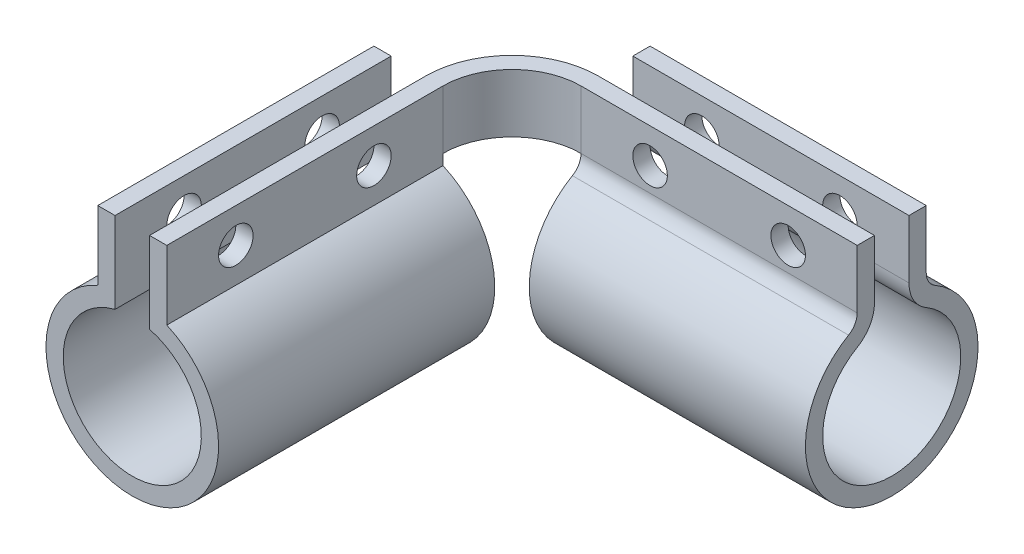
ISO-10303-21;
HEADER;
FILE_DESCRIPTION(('STEP AP214'),'2;1');
FILE_NAME('part.step','',(''),(''),'','','');
FILE_SCHEMA(('AUTOMOTIVE_DESIGN { 1 0 10303 214 1 1 1 1 }'));
ENDSEC;
DATA;
#1=APPLICATION_CONTEXT('core data for automotive mechanical design processes');
#2=APPLICATION_PROTOCOL_DEFINITION('international standard','automotive_design',2000,#1);
#3=PRODUCT_CONTEXT('',#1,'mechanical');
#4=PRODUCT('Part','Part','',(#3));
#5=PRODUCT_RELATED_PRODUCT_CATEGORY('part','',(#4));
#6=PRODUCT_DEFINITION_FORMATION('','',#4);
#7=PRODUCT_DEFINITION_CONTEXT('part definition',#1,'design');
#8=PRODUCT_DEFINITION('design','',#6,#7);
#9=PRODUCT_DEFINITION_SHAPE('','',#8);
#10=(LENGTH_UNIT() NAMED_UNIT(*) SI_UNIT(.MILLI.,.METRE.));
#11=(NAMED_UNIT(*) PLANE_ANGLE_UNIT() SI_UNIT($,.RADIAN.));
#12=(NAMED_UNIT(*) SI_UNIT($,.STERADIAN.) SOLID_ANGLE_UNIT());
#13=UNCERTAINTY_MEASURE_WITH_UNIT(LENGTH_MEASURE(1.E-05),#10,'distance_accuracy_value','');
#14=(GEOMETRIC_REPRESENTATION_CONTEXT(3) GLOBAL_UNCERTAINTY_ASSIGNED_CONTEXT((#13)) GLOBAL_UNIT_ASSIGNED_CONTEXT((#10,
#11,#12)) REPRESENTATION_CONTEXT('',''));
#15=CARTESIAN_POINT('',(0.,0.,0.));
#16=DIRECTION('',(0.,0.,1.));
#17=DIRECTION('',(1.,0.,0.));
#18=AXIS2_PLACEMENT_3D('',#15,#16,#17);
#19=CARTESIAN_POINT('',(80.,0.,10.));
#20=DIRECTION('',(0.,0.,1.));
#21=DIRECTION('',(1.,0.,0.));
#22=AXIS2_PLACEMENT_3D('',#19,#20,#21);
#23=PLANE('',#22);
#24=CARTESIAN_POINT('',(60.,32.9128784747792,10.));
#25=DIRECTION('',(0.,0.,1.));
#26=DIRECTION('',(1.,0.,0.));
#27=AXIS2_PLACEMENT_3D('',#24,#25,#26);
#28=CIRCLE('',#27,4.99999999999999);
#29=CARTESIAN_POINT('',(65.,32.9128784747792,10.));
#30=VERTEX_POINT('',#29);
#31=EDGE_CURVE('E270',#30,#30,#28,.T.);
#32=ORIENTED_EDGE('',*,*,#31,.F.);
#33=EDGE_LOOP('',(#32));
#34=FACE_BOUND('',#33,.T.);
#35=CARTESIAN_POINT('',(20.,32.9128784747792,10.));
#36=DIRECTION('',(0.,0.,1.));
#37=DIRECTION('',(1.,0.,0.));
#38=AXIS2_PLACEMENT_3D('',#35,#36,#37);
#39=CIRCLE('',#38,5.);
#40=CARTESIAN_POINT('',(25.,32.9128784747792,10.));
#41=VERTEX_POINT('',#40);
#42=EDGE_CURVE('E462',#41,#41,#39,.T.);
#43=ORIENTED_EDGE('',*,*,#42,.F.);
#44=EDGE_LOOP('',(#43));
#45=FACE_BOUND('',#44,.T.);
#46=DIRECTION('',(-1.,0.,0.));
#47=VECTOR('',#46,1.);
#48=CARTESIAN_POINT('',(80.,42.9128784747792,10.));
#49=LINE('',#48,#47);
#50=CARTESIAN_POINT('',(80.,42.9128784747792,10.));
#51=VERTEX_POINT('',#50);
#52=CARTESIAN_POINT('',(0.,42.9128784747792,10.));
#53=VERTEX_POINT('',#52);
#54=EDGE_CURVE('E423',#51,#53,#49,.T.);
#55=ORIENTED_EDGE('',*,*,#54,.T.);
#56=DIRECTION('',(0.,-1.,0.));
#57=VECTOR('',#56,1.);
#58=CARTESIAN_POINT('',(0.,0.,10.));
#59=LINE('',#58,#57);
#60=CARTESIAN_POINT('',(0.,25.98076,10.));
#61=VERTEX_POINT('',#60);
#62=EDGE_CURVE('E260',#53,#61,#59,.T.);
#63=ORIENTED_EDGE('',*,*,#62,.T.);
#64=DIRECTION('',(-1.,0.,0.));
#65=VECTOR('',#64,1.);
#66=CARTESIAN_POINT('',(80.,25.9807621135332,10.));
#67=LINE('',#66,#65);
#68=CARTESIAN_POINT('',(80.,25.9807621135332,10.));
#69=VERTEX_POINT('',#68);
#70=EDGE_CURVE('E400',#61,#69,#67,.F.);
#71=ORIENTED_EDGE('',*,*,#70,.T.);
#72=DIRECTION('',(0.,1.,0.));
#73=VECTOR('',#72,1.);
#74=CARTESIAN_POINT('',(80.,0.,10.));
#75=LINE('',#74,#73);
#76=EDGE_CURVE('E429',#69,#51,#75,.T.);
#77=ORIENTED_EDGE('',*,*,#76,.T.);
#78=EDGE_LOOP('',(#55,#63,#71,#77));
#79=FACE_BOUND('',#78,.T.);
#80=ADVANCED_FACE('F37',(#34,#45,#79),#23,.T.);
#81=CARTESIAN_POINT('',(80.,0.,0.));
#82=DIRECTION('',(-1.,0.,0.));
#83=DIRECTION('',(0.,0.,1.));
#84=AXIS2_PLACEMENT_3D('',#81,#82,#83);
#85=CYLINDRICAL_SURFACE('',#84,25.);
#86=CARTESIAN_POINT('',(80.,0.,0.));
#87=DIRECTION('',(1.,0.,0.));
#88=DIRECTION('',(0.,0.,-1.));
#89=AXIS2_PLACEMENT_3D('',#86,#87,#88);
#90=CIRCLE('',#89,25.);
#91=CARTESIAN_POINT('',(80.,21.650635094611,12.5));
#92=VERTEX_POINT('',#91);
#93=CARTESIAN_POINT('',(80.,21.650635094611,-12.5));
#94=VERTEX_POINT('',#93);
#95=EDGE_CURVE('E456',#92,#94,#90,.T.);
#96=ORIENTED_EDGE('',*,*,#95,.F.);
#97=DIRECTION('',(-1.,0.,0.));
#98=VECTOR('',#97,1.);
#99=CARTESIAN_POINT('',(80.,21.650635094611,12.5));
#100=LINE('',#99,#98);
#101=CARTESIAN_POINT('',(0.,21.650635094611,12.5));
#102=VERTEX_POINT('',#101);
#103=EDGE_CURVE('E402',#92,#102,#100,.T.);
#104=ORIENTED_EDGE('',*,*,#103,.T.);
#105=CARTESIAN_POINT('',(0.,0.,0.));
#106=DIRECTION('',(1.,0.,0.));
#107=DIRECTION('',(0.,0.,-1.));
#108=AXIS2_PLACEMENT_3D('',#105,#106,#107);
#109=CIRCLE('',#108,25.);
#110=CARTESIAN_POINT('',(0.,21.650635094611,-12.5));
#111=VERTEX_POINT('',#110);
#112=EDGE_CURVE('E438',#102,#111,#109,.T.);
#113=ORIENTED_EDGE('',*,*,#112,.T.);
#114=DIRECTION('',(-1.,0.,0.));
#115=VECTOR('',#114,1.);
#116=CARTESIAN_POINT('',(80.,21.650635094611,-12.5));
#117=LINE('',#116,#115);
#118=EDGE_CURVE('E405',#111,#94,#117,.F.);
#119=ORIENTED_EDGE('',*,*,#118,.T.);
#120=EDGE_LOOP('',(#96,#104,#113,#119));
#121=FACE_BOUND('',#120,.T.);
#122=ADVANCED_FACE('F314',(#121),#85,.T.);
#123=CARTESIAN_POINT('',(80.,0.,-10.));
#124=DIRECTION('',(0.,0.,-1.));
#125=DIRECTION('',(0.,1.,0.));
#126=AXIS2_PLACEMENT_3D('',#123,#124,#125);
#127=PLANE('',#126);
#128=CARTESIAN_POINT('',(60.,32.9128784747792,-10.));
#129=DIRECTION('',(0.,0.,1.));
#130=DIRECTION('',(1.,0.,0.));
#131=AXIS2_PLACEMENT_3D('',#128,#129,#130);
#132=CIRCLE('',#131,4.99999999999999);
#133=CARTESIAN_POINT('',(65.,32.9128784747792,-10.));
#134=VERTEX_POINT('',#133);
#135=EDGE_CURVE('E248',#134,#134,#132,.T.);
#136=ORIENTED_EDGE('',*,*,#135,.T.);
#137=EDGE_LOOP('',(#136));
#138=FACE_BOUND('',#137,.T.);
#139=CARTESIAN_POINT('',(20.,32.9128784747792,-10.));
#140=DIRECTION('',(0.,0.,1.));
#141=DIRECTION('',(1.,0.,0.));
#142=AXIS2_PLACEMENT_3D('',#139,#140,#141);
#143=CIRCLE('',#142,5.);
#144=CARTESIAN_POINT('',(25.,32.9128784747792,-10.));
#145=VERTEX_POINT('',#144);
#146=EDGE_CURVE('E416',#145,#145,#143,.T.);
#147=ORIENTED_EDGE('',*,*,#146,.T.);
#148=EDGE_LOOP('',(#147));
#149=FACE_BOUND('',#148,.T.);
#150=DIRECTION('',(0.,-1.,0.));
#151=VECTOR('',#150,1.);
#152=CARTESIAN_POINT('',(80.,0.,-10.));
#153=LINE('',#152,#151);
#154=CARTESIAN_POINT('',(80.,42.9128784747792,-10.));
#155=VERTEX_POINT('',#154);
#156=CARTESIAN_POINT('',(80.,25.9807621135332,-10.));
#157=VERTEX_POINT('',#156);
#158=EDGE_CURVE('E453',#155,#157,#153,.T.);
#159=ORIENTED_EDGE('',*,*,#158,.T.);
#160=DIRECTION('',(-1.,0.,0.));
#161=VECTOR('',#160,1.);
#162=CARTESIAN_POINT('',(80.,25.9807621135332,-10.));
#163=LINE('',#162,#161);
#164=CARTESIAN_POINT('',(0.,25.9807621135332,-10.));
#165=VERTEX_POINT('',#164);
#166=EDGE_CURVE('E397',#157,#165,#163,.T.);
#167=ORIENTED_EDGE('',*,*,#166,.T.);
#168=DIRECTION('',(0.,-1.,0.));
#169=VECTOR('',#168,1.);
#170=CARTESIAN_POINT('',(0.,0.,-10.));
#171=LINE('',#170,#169);
#172=CARTESIAN_POINT('',(0.,42.9128784747792,-10.));
#173=VERTEX_POINT('',#172);
#174=EDGE_CURVE('E435',#173,#165,#171,.T.);
#175=ORIENTED_EDGE('',*,*,#174,.F.);
#176=DIRECTION('',(-1.,0.,0.));
#177=VECTOR('',#176,1.);
#178=CARTESIAN_POINT('',(80.,42.9128784747792,-10.));
#179=LINE('',#178,#177);
#180=EDGE_CURVE('E407',#155,#173,#179,.T.);
#181=ORIENTED_EDGE('',*,*,#180,.F.);
#182=EDGE_LOOP('',(#159,#167,#175,#181));
#183=FACE_BOUND('',#182,.T.);
#184=ADVANCED_FACE('F320',(#138,#149,#183),#127,.T.);
#185=CARTESIAN_POINT('',(80.,42.9128784747792,0.));
#186=DIRECTION('',(0.,1.,0.));
#187=DIRECTION('',(0.,0.,1.));
#188=AXIS2_PLACEMENT_3D('',#185,#186,#187);
#189=PLANE('',#188);
#190=DIRECTION('',(0.,0.,-1.));
#191=VECTOR('',#190,1.);
#192=CARTESIAN_POINT('',(0.,42.9128784747792,0.));
#193=LINE('',#192,#191);
#194=CARTESIAN_POINT('',(0.,42.9128784747792,-5.));
#195=VERTEX_POINT('',#194);
#196=EDGE_CURVE('E432',#195,#173,#193,.T.);
#197=ORIENTED_EDGE('',*,*,#196,.F.);
#198=DIRECTION('',(-1.,0.,0.));
#199=VECTOR('',#198,1.);
#200=CARTESIAN_POINT('',(80.,42.9128784747792,-5.));
#201=LINE('',#200,#199);
#202=CARTESIAN_POINT('',(80.,42.9128784747792,-5.));
#203=VERTEX_POINT('',#202);
#204=EDGE_CURVE('E418',#203,#195,#201,.T.);
#205=ORIENTED_EDGE('',*,*,#204,.F.);
#206=DIRECTION('',(0.,0.,-1.));
#207=VECTOR('',#206,1.);
#208=CARTESIAN_POINT('',(80.,42.9128784747792,0.));
#209=LINE('',#208,#207);
#210=EDGE_CURVE('E450',#203,#155,#209,.T.);
#211=ORIENTED_EDGE('',*,*,#210,.T.);
#212=ORIENTED_EDGE('',*,*,#180,.T.);
#213=EDGE_LOOP('',(#197,#205,#211,#212));
#214=FACE_BOUND('',#213,.T.);
#215=ADVANCED_FACE('F510',(#214),#189,.T.);
#216=CARTESIAN_POINT('',(80.,0.,-5.));
#217=DIRECTION('',(0.,0.,1.));
#218=DIRECTION('',(0.,-1.,0.));
#219=AXIS2_PLACEMENT_3D('',#216,#217,#218);
#220=PLANE('',#219);
#221=CARTESIAN_POINT('',(60.,32.9128784747792,-5.));
#222=DIRECTION('',(0.,0.,1.));
#223=DIRECTION('',(0.,-1.,0.));
#224=AXIS2_PLACEMENT_3D('',#221,#222,#223);
#225=CIRCLE('',#224,4.99999999999999);
#226=CARTESIAN_POINT('',(60.,27.9128784747792,-5.));
#227=VERTEX_POINT('',#226);
#228=EDGE_CURVE('E411',#227,#227,#225,.T.);
#229=ORIENTED_EDGE('',*,*,#228,.F.);
#230=EDGE_LOOP('',(#229));
#231=FACE_BOUND('',#230,.T.);
#232=CARTESIAN_POINT('',(20.,32.9128784747792,-5.));
#233=DIRECTION('',(0.,0.,1.));
#234=DIRECTION('',(0.,-1.,0.));
#235=AXIS2_PLACEMENT_3D('',#232,#233,#234);
#236=CIRCLE('',#235,5.);
#237=CARTESIAN_POINT('',(20.,27.9128784747792,-5.));
#238=VERTEX_POINT('',#237);
#239=EDGE_CURVE('E415',#238,#238,#236,.T.);
#240=ORIENTED_EDGE('',*,*,#239,.F.);
#241=EDGE_LOOP('',(#240));
#242=FACE_BOUND('',#241,.T.);
#243=DIRECTION('',(0.,1.,0.));
#244=VECTOR('',#243,1.);
#245=CARTESIAN_POINT('',(0.,0.,-5.));
#246=LINE('',#245,#244);
#247=CARTESIAN_POINT('',(0.,25.9807621135332,-5.));
#248=VERTEX_POINT('',#247);
#249=EDGE_CURVE('E430',#248,#195,#246,.T.);
#250=ORIENTED_EDGE('',*,*,#249,.F.);
#251=DIRECTION('',(-1.,0.,0.));
#252=VECTOR('',#251,1.);
#253=CARTESIAN_POINT('',(80.,25.9807621135332,-5.));
#254=LINE('',#253,#252);
#255=CARTESIAN_POINT('',(80.,25.9807621135332,-5.));
#256=VERTEX_POINT('',#255);
#257=EDGE_CURVE('E377',#248,#256,#254,.F.);
#258=ORIENTED_EDGE('',*,*,#257,.T.);
#259=DIRECTION('',(0.,1.,0.));
#260=VECTOR('',#259,1.);
#261=CARTESIAN_POINT('',(80.,0.,-5.));
#262=LINE('',#261,#260);
#263=EDGE_CURVE('E448',#256,#203,#262,.T.);
#264=ORIENTED_EDGE('',*,*,#263,.T.);
#265=ORIENTED_EDGE('',*,*,#204,.T.);
#266=EDGE_LOOP('',(#250,#258,#264,#265));
#267=FACE_BOUND('',#266,.T.);
#268=ADVANCED_FACE('F506',(#231,#242,#267),#220,.T.);
#269=CARTESIAN_POINT('',(80.,0.,0.));
#270=DIRECTION('',(-1.,0.,0.));
#271=DIRECTION('',(0.,0.,1.));
#272=AXIS2_PLACEMENT_3D('',#269,#270,#271);
#273=CYLINDRICAL_SURFACE('',#272,20.);
#274=CARTESIAN_POINT('',(80.,0.,0.));
#275=DIRECTION('',(1.,0.,0.));
#276=DIRECTION('',(0.,0.,-1.));
#277=AXIS2_PLACEMENT_3D('',#274,#275,#276);
#278=CIRCLE('',#277,20.);
#279=CARTESIAN_POINT('',(80.,17.3205080756888,10.));
#280=VERTEX_POINT('',#279);
#281=CARTESIAN_POINT('',(80.,17.3205080756888,-10.));
#282=VERTEX_POINT('',#281);
#283=EDGE_CURVE('E445',#280,#282,#278,.T.);
#284=ORIENTED_EDGE('',*,*,#283,.T.);
#285=DIRECTION('',(-1.,0.,0.));
#286=VECTOR('',#285,1.);
#287=CARTESIAN_POINT('',(80.,17.3205080756888,-10.));
#288=LINE('',#287,#286);
#289=CARTESIAN_POINT('',(0.,17.3205080756888,-10.));
#290=VERTEX_POINT('',#289);
#291=EDGE_CURVE('E383',#282,#290,#288,.T.);
#292=ORIENTED_EDGE('',*,*,#291,.T.);
#293=CARTESIAN_POINT('',(0.,0.,0.));
#294=DIRECTION('',(1.,0.,0.));
#295=DIRECTION('',(0.,0.,-1.));
#296=AXIS2_PLACEMENT_3D('',#293,#294,#295);
#297=CIRCLE('',#296,20.);
#298=CARTESIAN_POINT('',(0.,17.3205080756888,10.));
#299=VERTEX_POINT('',#298);
#300=EDGE_CURVE('E426',#299,#290,#297,.T.);
#301=ORIENTED_EDGE('',*,*,#300,.F.);
#302=DIRECTION('',(-1.,0.,0.));
#303=VECTOR('',#302,1.);
#304=CARTESIAN_POINT('',(80.,17.3205080756888,10.));
#305=LINE('',#304,#303);
#306=EDGE_CURVE('E386',#299,#280,#305,.F.);
#307=ORIENTED_EDGE('',*,*,#306,.T.);
#308=EDGE_LOOP('',(#284,#292,#301,#307));
#309=FACE_BOUND('',#308,.T.);
#310=ADVANCED_FACE('F502',(#309),#273,.F.);
#311=CARTESIAN_POINT('',(80.,0.,5.));
#312=DIRECTION('',(0.,0.,1.));
#313=DIRECTION('',(1.,0.,0.));
#314=AXIS2_PLACEMENT_3D('',#311,#312,#313);
#315=PLANE('',#314);
#316=CARTESIAN_POINT('',(60.,32.9128784747792,5.));
#317=DIRECTION('',(0.,0.,1.));
#318=DIRECTION('',(1.,0.,0.));
#319=AXIS2_PLACEMENT_3D('',#316,#317,#318);
#320=CIRCLE('',#319,4.99999999999999);
#321=CARTESIAN_POINT('',(65.,32.9128784747792,5.));
#322=VERTEX_POINT('',#321);
#323=EDGE_CURVE('E408',#322,#322,#320,.T.);
#324=ORIENTED_EDGE('',*,*,#323,.T.);
#325=EDGE_LOOP('',(#324));
#326=FACE_BOUND('',#325,.T.);
#327=CARTESIAN_POINT('',(20.,32.9128784747792,5.));
#328=DIRECTION('',(0.,0.,1.));
#329=DIRECTION('',(1.,0.,0.));
#330=AXIS2_PLACEMENT_3D('',#327,#328,#329);
#331=CIRCLE('',#330,5.);
#332=CARTESIAN_POINT('',(25.,32.9128784747792,5.));
#333=VERTEX_POINT('',#332);
#334=EDGE_CURVE('E412',#333,#333,#331,.T.);
#335=ORIENTED_EDGE('',*,*,#334,.T.);
#336=EDGE_LOOP('',(#335));
#337=FACE_BOUND('',#336,.T.);
#338=DIRECTION('',(1.,0.,0.));
#339=VECTOR('',#338,1.);
#340=CARTESIAN_POINT('',(0.,25.9807621135332,5.));
#341=LINE('',#340,#339);
#342=CARTESIAN_POINT('',(80.,25.9807621135332,5.));
#343=VERTEX_POINT('',#342);
#344=CARTESIAN_POINT('',(0.,25.9807621135332,5.));
#345=VERTEX_POINT('',#344);
#346=EDGE_CURVE('E371',#343,#345,#341,.F.);
#347=ORIENTED_EDGE('',*,*,#346,.T.);
#348=DIRECTION('',(0.,-1.,0.));
#349=VECTOR('',#348,1.);
#350=CARTESIAN_POINT('',(0.,0.,5.));
#351=LINE('',#350,#349);
#352=CARTESIAN_POINT('',(0.,42.9128784747792,5.));
#353=VERTEX_POINT('',#352);
#354=EDGE_CURVE('E46',#345,#353,#351,.F.);
#355=ORIENTED_EDGE('',*,*,#354,.T.);
#356=DIRECTION('',(-1.,0.,0.));
#357=VECTOR('',#356,1.);
#358=CARTESIAN_POINT('',(80.,42.9128784747792,5.));
#359=LINE('',#358,#357);
#360=CARTESIAN_POINT('',(80.,42.9128784747792,5.));
#361=VERTEX_POINT('',#360);
#362=EDGE_CURVE('E421',#361,#353,#359,.T.);
#363=ORIENTED_EDGE('',*,*,#362,.F.);
#364=DIRECTION('',(0.,1.,0.));
#365=VECTOR('',#364,1.);
#366=CARTESIAN_POINT('',(80.,0.,5.));
#367=LINE('',#366,#365);
#368=EDGE_CURVE('E443',#343,#361,#367,.T.);
#369=ORIENTED_EDGE('',*,*,#368,.F.);
#370=EDGE_LOOP('',(#347,#355,#363,#369));
#371=FACE_BOUND('',#370,.T.);
#372=ADVANCED_FACE('F499',(#326,#337,#371),#315,.F.);
#373=CARTESIAN_POINT('',(80.,42.9128784747792,0.));
#374=DIRECTION('',(0.,1.,0.));
#375=DIRECTION('',(0.,0.,1.));
#376=AXIS2_PLACEMENT_3D('',#373,#374,#375);
#377=PLANE('',#376);
#378=ORIENTED_EDGE('',*,*,#362,.T.);
#379=CARTESIAN_POINT('',(0.,42.9128784747792,30.));
#380=DIRECTION('',(0.,1.,0.));
#381=DIRECTION('',(0.,0.,1.));
#382=AXIS2_PLACEMENT_3D('',#379,#380,#381);
#383=CIRCLE('',#382,25.);
#384=CARTESIAN_POINT('',(-25.,42.912877,30.));
#385=VERTEX_POINT('',#384);
#386=EDGE_CURVE('E11',#353,#385,#383,.T.);
#387=ORIENTED_EDGE('',*,*,#386,.T.);
#388=DIRECTION('',(0.,0.,-1.));
#389=VECTOR('',#388,1.);
#390=CARTESIAN_POINT('',(-25.,42.912877,110.));
#391=LINE('',#390,#389);
#392=CARTESIAN_POINT('',(-25.,42.912877,110.));
#393=VERTEX_POINT('',#392);
#394=EDGE_CURVE('E364',#393,#385,#391,.T.);
#395=ORIENTED_EDGE('',*,*,#394,.F.);
#396=DIRECTION('',(-1.,0.,0.));
#397=VECTOR('',#396,1.);
#398=CARTESIAN_POINT('',(0.,42.912877,110.));
#399=LINE('',#398,#397);
#400=CARTESIAN_POINT('',(-20.,42.912877,110.));
#401=VERTEX_POINT('',#400);
#402=EDGE_CURVE('E219',#401,#393,#399,.T.);
#403=ORIENTED_EDGE('',*,*,#402,.F.);
#404=DIRECTION('',(0.,0.,-1.));
#405=VECTOR('',#404,1.);
#406=CARTESIAN_POINT('',(-20.,42.912877,110.));
#407=LINE('',#406,#405);
#408=CARTESIAN_POINT('',(-20.,42.912877,30.));
#409=VERTEX_POINT('',#408);
#410=EDGE_CURVE('E360',#401,#409,#407,.T.);
#411=ORIENTED_EDGE('',*,*,#410,.T.);
#412=CARTESIAN_POINT('',(0.,42.9128784747792,30.));
#413=DIRECTION('',(0.,1.,0.));
#414=DIRECTION('',(0.,0.,1.));
#415=AXIS2_PLACEMENT_3D('',#412,#413,#414);
#416=CIRCLE('',#415,20.);
#417=EDGE_CURVE('E61',#409,#53,#416,.F.);
#418=ORIENTED_EDGE('',*,*,#417,.T.);
#419=ORIENTED_EDGE('',*,*,#54,.F.);
#420=DIRECTION('',(0.,0.,-1.));
#421=VECTOR('',#420,1.);
#422=CARTESIAN_POINT('',(80.,42.9128784747792,0.));
#423=LINE('',#422,#421);
#424=EDGE_CURVE('E425',#51,#361,#423,.T.);
#425=ORIENTED_EDGE('',*,*,#424,.T.);
#426=EDGE_LOOP('',(#378,#387,#395,#403,#411,#418,#419,#425));
#427=FACE_BOUND('',#426,.T.);
#428=ADVANCED_FACE('F361',(#427),#377,.T.);
#429=CARTESIAN_POINT('',(80.,0.,0.));
#430=DIRECTION('',(1.,0.,0.));
#431=DIRECTION('',(0.,0.,-1.));
#432=AXIS2_PLACEMENT_3D('',#429,#430,#431);
#433=PLANE('',#432);
#434=ORIENTED_EDGE('',*,*,#263,.F.);
#435=CARTESIAN_POINT('',(80.,25.9807621135332,-15.));
#436=DIRECTION('',(1.,0.,0.));
#437=DIRECTION('',(0.,0.,-1.));
#438=AXIS2_PLACEMENT_3D('',#435,#436,#437);
#439=CIRCLE('',#438,10.);
#440=EDGE_CURVE('E373',#256,#282,#439,.T.);
#441=ORIENTED_EDGE('',*,*,#440,.T.);
#442=ORIENTED_EDGE('',*,*,#283,.F.);
#443=CARTESIAN_POINT('',(80.,25.9807621135332,15.));
#444=DIRECTION('',(1.,0.,0.));
#445=DIRECTION('',(0.,0.,-1.));
#446=AXIS2_PLACEMENT_3D('',#443,#444,#445);
#447=CIRCLE('',#446,10.);
#448=EDGE_CURVE('E375',#280,#343,#447,.T.);
#449=ORIENTED_EDGE('',*,*,#448,.T.);
#450=ORIENTED_EDGE('',*,*,#368,.T.);
#451=ORIENTED_EDGE('',*,*,#424,.F.);
#452=ORIENTED_EDGE('',*,*,#76,.F.);
#453=CARTESIAN_POINT('',(80.,25.9807621135332,15.));
#454=DIRECTION('',(1.,0.,0.));
#455=DIRECTION('',(0.,0.,-1.));
#456=AXIS2_PLACEMENT_3D('',#453,#454,#455);
#457=CIRCLE('',#456,5.);
#458=EDGE_CURVE('E392',#69,#92,#457,.F.);
#459=ORIENTED_EDGE('',*,*,#458,.T.);
#460=ORIENTED_EDGE('',*,*,#95,.T.);
#461=CARTESIAN_POINT('',(80.,25.9807621135332,-15.));
#462=DIRECTION('',(1.,0.,0.));
#463=DIRECTION('',(0.,0.,-1.));
#464=AXIS2_PLACEMENT_3D('',#461,#462,#463);
#465=CIRCLE('',#464,5.);
#466=EDGE_CURVE('E388',#94,#157,#465,.F.);
#467=ORIENTED_EDGE('',*,*,#466,.T.);
#468=ORIENTED_EDGE('',*,*,#158,.F.);
#469=ORIENTED_EDGE('',*,*,#210,.F.);
#470=EDGE_LOOP('',(#434,#441,#442,#449,#450,#451,#452,#459,#460,#467,#468,#469));
#471=FACE_BOUND('',#470,.T.);
#472=ADVANCED_FACE('F489',(#471),#433,.T.);
#473=CARTESIAN_POINT('',(0.,0.,0.));
#474=DIRECTION('',(1.,0.,0.));
#475=DIRECTION('',(0.,0.,-1.));
#476=AXIS2_PLACEMENT_3D('',#473,#474,#475);
#477=PLANE('',#476);
#478=CARTESIAN_POINT('',(0.,25.9807621135332,15.));
#479=DIRECTION('',(1.,0.,0.));
#480=DIRECTION('',(0.,0.,-1.));
#481=AXIS2_PLACEMENT_3D('',#478,#479,#480);
#482=CIRCLE('',#481,5.);
#483=EDGE_CURVE('E394',#102,#61,#482,.T.);
#484=ORIENTED_EDGE('',*,*,#483,.T.);
#485=DIRECTION('',(0.,0.,-1.));
#486=VECTOR('',#485,1.);
#487=CARTESIAN_POINT('',(0.,25.98076,5.));
#488=LINE('',#487,#486);
#489=EDGE_CURVE('E194',#61,#345,#488,.T.);
#490=ORIENTED_EDGE('',*,*,#489,.T.);
#491=CARTESIAN_POINT('',(0.,25.9807621135332,15.));
#492=DIRECTION('',(1.,0.,0.));
#493=DIRECTION('',(0.,0.,-1.));
#494=AXIS2_PLACEMENT_3D('',#491,#492,#493);
#495=CIRCLE('',#494,10.);
#496=EDGE_CURVE('E381',#345,#299,#495,.F.);
#497=ORIENTED_EDGE('',*,*,#496,.T.);
#498=ORIENTED_EDGE('',*,*,#300,.T.);
#499=CARTESIAN_POINT('',(0.,25.9807621135332,-15.));
#500=DIRECTION('',(1.,0.,0.));
#501=DIRECTION('',(0.,0.,-1.));
#502=AXIS2_PLACEMENT_3D('',#499,#500,#501);
#503=CIRCLE('',#502,10.);
#504=EDGE_CURVE('E379',#290,#248,#503,.F.);
#505=ORIENTED_EDGE('',*,*,#504,.T.);
#506=ORIENTED_EDGE('',*,*,#249,.T.);
#507=ORIENTED_EDGE('',*,*,#196,.T.);
#508=ORIENTED_EDGE('',*,*,#174,.T.);
#509=CARTESIAN_POINT('',(0.,25.9807621135332,-15.));
#510=DIRECTION('',(1.,0.,0.));
#511=DIRECTION('',(0.,0.,-1.));
#512=AXIS2_PLACEMENT_3D('',#509,#510,#511);
#513=CIRCLE('',#512,5.);
#514=EDGE_CURVE('E390',#165,#111,#513,.T.);
#515=ORIENTED_EDGE('',*,*,#514,.T.);
#516=ORIENTED_EDGE('',*,*,#112,.F.);
#517=EDGE_LOOP('',(#484,#490,#497,#498,#505,#506,#507,#508,#515,#516));
#518=FACE_BOUND('',#517,.T.);
#519=ADVANCED_FACE('F492',(#518),#477,.F.);
#520=CARTESIAN_POINT('',(20.,32.9128784747792,-10.));
#521=DIRECTION('',(0.,0.,1.));
#522=DIRECTION('',(1.,0.,0.));
#523=AXIS2_PLACEMENT_3D('',#520,#521,#522);
#524=CYLINDRICAL_SURFACE('',#523,5.);
#525=ORIENTED_EDGE('',*,*,#42,.T.);
#526=EDGE_LOOP('',(#525));
#527=FACE_BOUND('',#526,.T.);
#528=ORIENTED_EDGE('',*,*,#334,.F.);
#529=EDGE_LOOP('',(#528));
#530=FACE_BOUND('',#529,.T.);
#531=ADVANCED_FACE('F487',(#527,#530),#524,.F.);
#532=ORIENTED_EDGE('',*,*,#239,.T.);
#533=EDGE_LOOP('',(#532));
#534=FACE_BOUND('',#533,.T.);
#535=ORIENTED_EDGE('',*,*,#146,.F.);
#536=EDGE_LOOP('',(#535));
#537=FACE_BOUND('',#536,.T.);
#538=ADVANCED_FACE('F482',(#534,#537),#524,.F.);
#539=CARTESIAN_POINT('',(60.,32.9128784747792,-10.));
#540=DIRECTION('',(0.,0.,1.));
#541=DIRECTION('',(1.,0.,0.));
#542=AXIS2_PLACEMENT_3D('',#539,#540,#541);
#543=CYLINDRICAL_SURFACE('',#542,4.99999999999999);
#544=ORIENTED_EDGE('',*,*,#31,.T.);
#545=EDGE_LOOP('',(#544));
#546=FACE_BOUND('',#545,.T.);
#547=ORIENTED_EDGE('',*,*,#323,.F.);
#548=EDGE_LOOP('',(#547));
#549=FACE_BOUND('',#548,.T.);
#550=ADVANCED_FACE('F476',(#546,#549),#543,.F.);
#551=ORIENTED_EDGE('',*,*,#228,.T.);
#552=EDGE_LOOP('',(#551));
#553=FACE_BOUND('',#552,.T.);
#554=ORIENTED_EDGE('',*,*,#135,.F.);
#555=EDGE_LOOP('',(#554));
#556=FACE_BOUND('',#555,.T.);
#557=ADVANCED_FACE('F331',(#553,#556),#543,.F.);
#558=CARTESIAN_POINT('',(80.,25.9807621135332,15.));
#559=DIRECTION('',(-1.,0.,0.));
#560=DIRECTION('',(0.,0.,1.));
#561=AXIS2_PLACEMENT_3D('',#558,#559,#560);
#562=CYLINDRICAL_SURFACE('',#561,5.);
#563=ORIENTED_EDGE('',*,*,#458,.F.);
#564=ORIENTED_EDGE('',*,*,#70,.F.);
#565=ORIENTED_EDGE('',*,*,#483,.F.);
#566=ORIENTED_EDGE('',*,*,#103,.F.);
#567=EDGE_LOOP('',(#563,#564,#565,#566));
#568=FACE_BOUND('',#567,.T.);
#569=ADVANCED_FACE('F327',(#568),#562,.F.);
#570=CARTESIAN_POINT('',(80.,25.9807621135332,-15.));
#571=DIRECTION('',(-1.,0.,0.));
#572=DIRECTION('',(0.,0.,1.));
#573=AXIS2_PLACEMENT_3D('',#570,#571,#572);
#574=CYLINDRICAL_SURFACE('',#573,5.);
#575=ORIENTED_EDGE('',*,*,#466,.F.);
#576=ORIENTED_EDGE('',*,*,#118,.F.);
#577=ORIENTED_EDGE('',*,*,#514,.F.);
#578=ORIENTED_EDGE('',*,*,#166,.F.);
#579=EDGE_LOOP('',(#575,#576,#577,#578));
#580=FACE_BOUND('',#579,.T.);
#581=ADVANCED_FACE('F330',(#580),#574,.F.);
#582=CARTESIAN_POINT('',(80.,25.9807621135332,-15.));
#583=DIRECTION('',(-1.,0.,0.));
#584=DIRECTION('',(0.,0.,1.));
#585=AXIS2_PLACEMENT_3D('',#582,#583,#584);
#586=CYLINDRICAL_SURFACE('',#585,10.);
#587=ORIENTED_EDGE('',*,*,#440,.F.);
#588=ORIENTED_EDGE('',*,*,#257,.F.);
#589=ORIENTED_EDGE('',*,*,#504,.F.);
#590=ORIENTED_EDGE('',*,*,#291,.F.);
#591=EDGE_LOOP('',(#587,#588,#589,#590));
#592=FACE_BOUND('',#591,.T.);
#593=ADVANCED_FACE('F335',(#592),#586,.T.);
#594=CARTESIAN_POINT('',(80.,25.9807621135332,15.));
#595=DIRECTION('',(-1.,0.,0.));
#596=DIRECTION('',(0.,0.,1.));
#597=AXIS2_PLACEMENT_3D('',#594,#595,#596);
#598=CYLINDRICAL_SURFACE('',#597,10.);
#599=ORIENTED_EDGE('',*,*,#448,.F.);
#600=ORIENTED_EDGE('',*,*,#306,.F.);
#601=ORIENTED_EDGE('',*,*,#496,.F.);
#602=ORIENTED_EDGE('',*,*,#346,.F.);
#603=EDGE_LOOP('',(#599,#600,#601,#602));
#604=FACE_BOUND('',#603,.T.);
#605=ADVANCED_FACE('F339',(#604),#598,.T.);
#606=CARTESIAN_POINT('',(0.,25.98076,0.));
#607=DIRECTION('',(0.,-1.,0.));
#608=DIRECTION('',(0.,0.,-1.));
#609=AXIS2_PLACEMENT_3D('',#606,#607,#608);
#610=PLANE('',#609);
#611=DIRECTION('',(1.,0.,0.));
#612=VECTOR('',#611,1.);
#613=CARTESIAN_POINT('',(-20.,25.98076,30.));
#614=LINE('',#613,#612);
#615=CARTESIAN_POINT('',(-25.,25.98076,30.));
#616=VERTEX_POINT('',#615);
#617=CARTESIAN_POINT('',(-20.,25.98076,30.));
#618=VERTEX_POINT('',#617);
#619=EDGE_CURVE('E245',#616,#618,#614,.T.);
#620=ORIENTED_EDGE('',*,*,#619,.F.);
#621=CARTESIAN_POINT('',(0.,25.98076,30.));
#622=DIRECTION('',(0.,-1.,0.));
#623=DIRECTION('',(0.,0.,-1.));
#624=AXIS2_PLACEMENT_3D('',#621,#622,#623);
#625=CIRCLE('',#624,25.);
#626=EDGE_CURVE('E263',#616,#345,#625,.T.);
#627=ORIENTED_EDGE('',*,*,#626,.T.);
#628=ORIENTED_EDGE('',*,*,#489,.F.);
#629=CARTESIAN_POINT('',(0.,25.98076,30.));
#630=DIRECTION('',(0.,-1.,0.));
#631=DIRECTION('',(0.,0.,-1.));
#632=AXIS2_PLACEMENT_3D('',#629,#630,#631);
#633=CIRCLE('',#632,20.);
#634=EDGE_CURVE('E257',#61,#618,#633,.F.);
#635=ORIENTED_EDGE('',*,*,#634,.T.);
#636=EDGE_LOOP('',(#620,#627,#628,#635));
#637=FACE_BOUND('',#636,.T.);
#638=ADVANCED_FACE('F342',(#637),#610,.T.);
#639=CARTESIAN_POINT('',(0.,0.,30.));
#640=DIRECTION('',(0.,-1.,0.));
#641=DIRECTION('',(0.,0.,-1.));
#642=AXIS2_PLACEMENT_3D('',#639,#640,#641);
#643=CYLINDRICAL_SURFACE('',#642,20.);
#644=ORIENTED_EDGE('',*,*,#417,.F.);
#645=DIRECTION('',(0.,-1.,0.));
#646=VECTOR('',#645,1.);
#647=CARTESIAN_POINT('',(-20.,42.912877,30.));
#648=LINE('',#647,#646);
#649=EDGE_CURVE('E254',#409,#618,#648,.T.);
#650=ORIENTED_EDGE('',*,*,#649,.T.);
#651=ORIENTED_EDGE('',*,*,#634,.F.);
#652=ORIENTED_EDGE('',*,*,#62,.F.);
#653=EDGE_LOOP('',(#644,#650,#651,#652));
#654=FACE_BOUND('',#653,.T.);
#655=ADVANCED_FACE('F344',(#654),#643,.F.);
#656=CARTESIAN_POINT('',(0.,42.912877,30.));
#657=DIRECTION('',(0.,-1.,0.));
#658=DIRECTION('',(0.,0.,-1.));
#659=AXIS2_PLACEMENT_3D('',#656,#657,#658);
#660=CYLINDRICAL_SURFACE('',#659,25.);
#661=ORIENTED_EDGE('',*,*,#386,.F.);
#662=ORIENTED_EDGE('',*,*,#354,.F.);
#663=ORIENTED_EDGE('',*,*,#626,.F.);
#664=DIRECTION('',(0.,-1.,0.));
#665=VECTOR('',#664,1.);
#666=CARTESIAN_POINT('',(-25.,42.912877,30.));
#667=LINE('',#666,#665);
#668=EDGE_CURVE('E267',#385,#616,#667,.T.);
#669=ORIENTED_EDGE('',*,*,#668,.F.);
#670=EDGE_LOOP('',(#661,#662,#663,#669));
#671=FACE_BOUND('',#670,.T.);
#672=ADVANCED_FACE('F39',(#671),#660,.T.);
#673=CARTESIAN_POINT('',(0.,0.,30.));
#674=DIRECTION('',(0.,0.,1.));
#675=DIRECTION('',(1.,0.,0.));
#676=AXIS2_PLACEMENT_3D('',#673,#674,#675);
#677=PLANE('',#676);
#678=DIRECTION('',(0.,1.,0.));
#679=VECTOR('',#678,1.);
#680=CARTESIAN_POINT('',(-25.,0.,30.));
#681=LINE('',#680,#679);
#682=CARTESIAN_POINT('',(-25.,19.3649167310371,30.));
#683=VERTEX_POINT('',#682);
#684=EDGE_CURVE('E242',#683,#616,#681,.T.);
#685=ORIENTED_EDGE('',*,*,#684,.T.);
#686=ORIENTED_EDGE('',*,*,#619,.T.);
#687=DIRECTION('',(0.,-1.,0.));
#688=VECTOR('',#687,1.);
#689=CARTESIAN_POINT('',(-20.,0.,30.));
#690=LINE('',#689,#688);
#691=CARTESIAN_POINT('',(-20.,22.9128784747792,30.));
#692=VERTEX_POINT('',#691);
#693=EDGE_CURVE('E234',#618,#692,#690,.T.);
#694=ORIENTED_EDGE('',*,*,#693,.T.);
#695=CARTESIAN_POINT('',(-30.,0.,30.));
#696=DIRECTION('',(0.,0.,1.));
#697=DIRECTION('',(1.,0.,0.));
#698=AXIS2_PLACEMENT_3D('',#695,#696,#697);
#699=CIRCLE('',#698,25.);
#700=CARTESIAN_POINT('',(-40.,22.9128784747792,30.));
#701=VERTEX_POINT('',#700);
#702=EDGE_CURVE('E232',#701,#692,#699,.T.);
#703=ORIENTED_EDGE('',*,*,#702,.F.);
#704=DIRECTION('',(0.,1.,0.));
#705=VECTOR('',#704,1.);
#706=CARTESIAN_POINT('',(-40.,0.,30.));
#707=LINE('',#706,#705);
#708=CARTESIAN_POINT('',(-40.,42.9128784747792,30.));
#709=VERTEX_POINT('',#708);
#710=EDGE_CURVE('E190',#701,#709,#707,.T.);
#711=ORIENTED_EDGE('',*,*,#710,.T.);
#712=DIRECTION('',(1.,0.,0.));
#713=VECTOR('',#712,1.);
#714=CARTESIAN_POINT('',(0.,42.9128784747792,30.));
#715=LINE('',#714,#713);
#716=CARTESIAN_POINT('',(-35.,42.9128784747792,30.));
#717=VERTEX_POINT('',#716);
#718=EDGE_CURVE('E209',#709,#717,#715,.T.);
#719=ORIENTED_EDGE('',*,*,#718,.T.);
#720=DIRECTION('',(0.,1.,0.));
#721=VECTOR('',#720,1.);
#722=CARTESIAN_POINT('',(-35.,0.,30.));
#723=LINE('',#722,#721);
#724=CARTESIAN_POINT('',(-35.,19.3649167310371,30.));
#725=VERTEX_POINT('',#724);
#726=EDGE_CURVE('E212',#725,#717,#723,.T.);
#727=ORIENTED_EDGE('',*,*,#726,.F.);
#728=CARTESIAN_POINT('',(-30.,0.,30.));
#729=DIRECTION('',(0.,0.,1.));
#730=DIRECTION('',(1.,0.,0.));
#731=AXIS2_PLACEMENT_3D('',#728,#729,#730);
#732=CIRCLE('',#731,20.);
#733=EDGE_CURVE('E754',#725,#683,#732,.T.);
#734=ORIENTED_EDGE('',*,*,#733,.T.);
#735=EDGE_LOOP('',(#685,#686,#694,#703,#711,#719,#727,#734));
#736=FACE_BOUND('',#735,.T.);
#737=ADVANCED_FACE('F351',(#736),#677,.F.);
#738=CARTESIAN_POINT('',(-40.,0.,110.));
#739=DIRECTION('',(-1.,0.,0.));
#740=DIRECTION('',(0.,0.,1.));
#741=AXIS2_PLACEMENT_3D('',#738,#739,#740);
#742=PLANE('',#741);
#743=CARTESIAN_POINT('',(-40.,32.9128784747792,50.));
#744=DIRECTION('',(1.,0.,0.));
#745=DIRECTION('',(0.,0.,-1.));
#746=AXIS2_PLACEMENT_3D('',#743,#744,#745);
#747=CIRCLE('',#746,5.);
#748=CARTESIAN_POINT('',(-40.,32.9128784747792,45.));
#749=VERTEX_POINT('',#748);
#750=EDGE_CURVE('E290',#749,#749,#747,.T.);
#751=ORIENTED_EDGE('',*,*,#750,.T.);
#752=EDGE_LOOP('',(#751));
#753=FACE_BOUND('',#752,.T.);
#754=CARTESIAN_POINT('',(-40.,32.9128784747792,90.));
#755=DIRECTION('',(1.,0.,0.));
#756=DIRECTION('',(0.,0.,-1.));
#757=AXIS2_PLACEMENT_3D('',#754,#755,#756);
#758=CIRCLE('',#757,4.99999999999999);
#759=CARTESIAN_POINT('',(-40.,32.9128784747792,85.));
#760=VERTEX_POINT('',#759);
#761=EDGE_CURVE('E275',#760,#760,#758,.T.);
#762=ORIENTED_EDGE('',*,*,#761,.T.);
#763=EDGE_LOOP('',(#762));
#764=FACE_BOUND('',#763,.T.);
#765=ORIENTED_EDGE('',*,*,#710,.F.);
#766=DIRECTION('',(0.,0.,-1.));
#767=VECTOR('',#766,1.);
#768=CARTESIAN_POINT('',(-40.,22.9128784747792,110.));
#769=LINE('',#768,#767);
#770=CARTESIAN_POINT('',(-40.,22.9128784747792,110.));
#771=VERTEX_POINT('',#770);
#772=EDGE_CURVE('E183',#771,#701,#769,.T.);
#773=ORIENTED_EDGE('',*,*,#772,.F.);
#774=DIRECTION('',(0.,1.,0.));
#775=VECTOR('',#774,1.);
#776=CARTESIAN_POINT('',(-40.,0.,110.));
#777=LINE('',#776,#775);
#778=CARTESIAN_POINT('',(-40.,42.9128784747792,110.));
#779=VERTEX_POINT('',#778);
#780=EDGE_CURVE('E187',#771,#779,#777,.T.);
#781=ORIENTED_EDGE('',*,*,#780,.T.);
#782=DIRECTION('',(0.,0.,-1.));
#783=VECTOR('',#782,1.);
#784=CARTESIAN_POINT('',(-40.,42.9128784747792,110.));
#785=LINE('',#784,#783);
#786=EDGE_CURVE('E230',#779,#709,#785,.T.);
#787=ORIENTED_EDGE('',*,*,#786,.T.);
#788=EDGE_LOOP('',(#765,#773,#781,#787));
#789=FACE_BOUND('',#788,.T.);
#790=ADVANCED_FACE('F185',(#753,#764,#789),#742,.T.);
#791=CARTESIAN_POINT('',(-30.,0.,110.));
#792=DIRECTION('',(0.,0.,-1.));
#793=DIRECTION('',(-1.,0.,0.));
#794=AXIS2_PLACEMENT_3D('',#791,#792,#793);
#795=CYLINDRICAL_SURFACE('',#794,25.);
#796=ORIENTED_EDGE('',*,*,#702,.T.);
#797=DIRECTION('',(0.,0.,-1.));
#798=VECTOR('',#797,1.);
#799=CARTESIAN_POINT('',(-20.,22.9128784747792,110.));
#800=LINE('',#799,#798);
#801=CARTESIAN_POINT('',(-20.,22.9128784747792,110.));
#802=VERTEX_POINT('',#801);
#803=EDGE_CURVE('E195',#802,#692,#800,.T.);
#804=ORIENTED_EDGE('',*,*,#803,.F.);
#805=CARTESIAN_POINT('',(-30.,0.,110.));
#806=DIRECTION('',(0.,0.,1.));
#807=DIRECTION('',(1.,0.,0.));
#808=AXIS2_PLACEMENT_3D('',#805,#806,#807);
#809=CIRCLE('',#808,25.);
#810=EDGE_CURVE('E198',#771,#802,#809,.T.);
#811=ORIENTED_EDGE('',*,*,#810,.F.);
#812=ORIENTED_EDGE('',*,*,#772,.T.);
#813=EDGE_LOOP('',(#796,#804,#811,#812));
#814=FACE_BOUND('',#813,.T.);
#815=ADVANCED_FACE('F199',(#814),#795,.T.);
#816=CARTESIAN_POINT('',(-20.,0.,110.));
#817=DIRECTION('',(1.,0.,0.));
#818=DIRECTION('',(0.,0.,-1.));
#819=AXIS2_PLACEMENT_3D('',#816,#817,#818);
#820=PLANE('',#819);
#821=CARTESIAN_POINT('',(-20.,32.9128784747792,50.));
#822=DIRECTION('',(1.,0.,0.));
#823=DIRECTION('',(0.,0.,-1.));
#824=AXIS2_PLACEMENT_3D('',#821,#822,#823);
#825=CIRCLE('',#824,5.);
#826=CARTESIAN_POINT('',(-20.,32.9128784747792,45.));
#827=VERTEX_POINT('',#826);
#828=EDGE_CURVE('E280',#827,#827,#825,.T.);
#829=ORIENTED_EDGE('',*,*,#828,.F.);
#830=EDGE_LOOP('',(#829));
#831=FACE_BOUND('',#830,.T.);
#832=CARTESIAN_POINT('',(-20.,32.9128784747792,90.));
#833=DIRECTION('',(1.,0.,0.));
#834=DIRECTION('',(0.,0.,-1.));
#835=AXIS2_PLACEMENT_3D('',#832,#833,#834);
#836=CIRCLE('',#835,4.99999999999999);
#837=CARTESIAN_POINT('',(-20.,32.9128784747792,85.));
#838=VERTEX_POINT('',#837);
#839=EDGE_CURVE('E215',#838,#838,#836,.T.);
#840=ORIENTED_EDGE('',*,*,#839,.F.);
#841=EDGE_LOOP('',(#840));
#842=FACE_BOUND('',#841,.T.);
#843=ORIENTED_EDGE('',*,*,#649,.F.);
#844=ORIENTED_EDGE('',*,*,#410,.F.);
#845=DIRECTION('',(0.,-1.,0.));
#846=VECTOR('',#845,1.);
#847=CARTESIAN_POINT('',(-20.,0.,110.));
#848=LINE('',#847,#846);
#849=EDGE_CURVE('E204',#401,#802,#848,.T.);
#850=ORIENTED_EDGE('',*,*,#849,.T.);
#851=ORIENTED_EDGE('',*,*,#803,.T.);
#852=ORIENTED_EDGE('',*,*,#693,.F.);
#853=EDGE_LOOP('',(#843,#844,#850,#851,#852));
#854=FACE_BOUND('',#853,.T.);
#855=ADVANCED_FACE('F367',(#831,#842,#854),#820,.T.);
#856=CARTESIAN_POINT('',(-25.,0.,110.));
#857=DIRECTION('',(-1.,0.,0.));
#858=DIRECTION('',(0.,0.,1.));
#859=AXIS2_PLACEMENT_3D('',#856,#857,#858);
#860=PLANE('',#859);
#861=CARTESIAN_POINT('',(-25.,32.9128784747792,50.));
#862=DIRECTION('',(-1.,0.,0.));
#863=DIRECTION('',(0.,0.,1.));
#864=AXIS2_PLACEMENT_3D('',#861,#862,#863);
#865=CIRCLE('',#864,5.);
#866=CARTESIAN_POINT('',(-25.,32.9128784747792,55.));
#867=VERTEX_POINT('',#866);
#868=EDGE_CURVE('E285',#867,#867,#865,.T.);
#869=ORIENTED_EDGE('',*,*,#868,.F.);
#870=EDGE_LOOP('',(#869));
#871=FACE_BOUND('',#870,.T.);
#872=CARTESIAN_POINT('',(-25.,32.9128784747792,90.));
#873=DIRECTION('',(-1.,0.,0.));
#874=DIRECTION('',(0.,0.,1.));
#875=AXIS2_PLACEMENT_3D('',#872,#873,#874);
#876=CIRCLE('',#875,4.99999999999999);
#877=CARTESIAN_POINT('',(-25.,32.9128784747792,95.));
#878=VERTEX_POINT('',#877);
#879=EDGE_CURVE('E274',#878,#878,#876,.T.);
#880=ORIENTED_EDGE('',*,*,#879,.F.);
#881=EDGE_LOOP('',(#880));
#882=FACE_BOUND('',#881,.T.);
#883=ORIENTED_EDGE('',*,*,#684,.F.);
#884=DIRECTION('',(0.,0.,-1.));
#885=VECTOR('',#884,1.);
#886=CARTESIAN_POINT('',(-25.,19.3649167310371,110.));
#887=LINE('',#886,#885);
#888=CARTESIAN_POINT('',(-25.,19.3649167310371,110.));
#889=VERTEX_POINT('',#888);
#890=EDGE_CURVE('E750',#889,#683,#887,.T.);
#891=ORIENTED_EDGE('',*,*,#890,.F.);
#892=DIRECTION('',(0.,1.,0.));
#893=VECTOR('',#892,1.);
#894=CARTESIAN_POINT('',(-25.,0.,110.));
#895=LINE('',#894,#893);
#896=EDGE_CURVE('E221',#889,#393,#895,.T.);
#897=ORIENTED_EDGE('',*,*,#896,.T.);
#898=ORIENTED_EDGE('',*,*,#394,.T.);
#899=ORIENTED_EDGE('',*,*,#668,.T.);
#900=EDGE_LOOP('',(#883,#891,#897,#898,#899));
#901=FACE_BOUND('',#900,.T.);
#902=ADVANCED_FACE('F658',(#871,#882,#901),#860,.T.);
#903=CARTESIAN_POINT('',(-30.,0.,110.));
#904=DIRECTION('',(0.,0.,-1.));
#905=DIRECTION('',(-1.,0.,0.));
#906=AXIS2_PLACEMENT_3D('',#903,#904,#905);
#907=CYLINDRICAL_SURFACE('',#906,20.);
#908=ORIENTED_EDGE('',*,*,#733,.F.);
#909=DIRECTION('',(0.,0.,-1.));
#910=VECTOR('',#909,1.);
#911=CARTESIAN_POINT('',(-35.,19.3649167310371,110.));
#912=LINE('',#911,#910);
#913=CARTESIAN_POINT('',(-35.,19.3649167310371,110.));
#914=VERTEX_POINT('',#913);
#915=EDGE_CURVE('E763',#914,#725,#912,.T.);
#916=ORIENTED_EDGE('',*,*,#915,.F.);
#917=CARTESIAN_POINT('',(-30.,0.,110.));
#918=DIRECTION('',(0.,0.,1.));
#919=DIRECTION('',(1.,0.,0.));
#920=AXIS2_PLACEMENT_3D('',#917,#918,#919);
#921=CIRCLE('',#920,20.);
#922=EDGE_CURVE('E224',#914,#889,#921,.T.);
#923=ORIENTED_EDGE('',*,*,#922,.T.);
#924=ORIENTED_EDGE('',*,*,#890,.T.);
#925=EDGE_LOOP('',(#908,#916,#923,#924));
#926=FACE_BOUND('',#925,.T.);
#927=ADVANCED_FACE('F653',(#926),#907,.F.);
#928=CARTESIAN_POINT('',(-35.,0.,110.));
#929=DIRECTION('',(-1.,0.,0.));
#930=DIRECTION('',(0.,0.,1.));
#931=AXIS2_PLACEMENT_3D('',#928,#929,#930);
#932=PLANE('',#931);
#933=CARTESIAN_POINT('',(-35.,32.9128784747792,50.));
#934=DIRECTION('',(-1.,0.,0.));
#935=DIRECTION('',(0.,0.,1.));
#936=AXIS2_PLACEMENT_3D('',#933,#934,#935);
#937=CIRCLE('',#936,5.);
#938=CARTESIAN_POINT('',(-35.,32.9128784747792,55.));
#939=VERTEX_POINT('',#938);
#940=EDGE_CURVE('E41',#939,#939,#937,.T.);
#941=ORIENTED_EDGE('',*,*,#940,.T.);
#942=EDGE_LOOP('',(#941));
#943=FACE_BOUND('',#942,.T.);
#944=CARTESIAN_POINT('',(-35.,32.9128784747792,90.));
#945=DIRECTION('',(-1.,0.,0.));
#946=DIRECTION('',(0.,0.,1.));
#947=AXIS2_PLACEMENT_3D('',#944,#945,#946);
#948=CIRCLE('',#947,4.99999999999999);
#949=CARTESIAN_POINT('',(-35.,32.9128784747792,95.));
#950=VERTEX_POINT('',#949);
#951=EDGE_CURVE('E272',#950,#950,#948,.T.);
#952=ORIENTED_EDGE('',*,*,#951,.T.);
#953=EDGE_LOOP('',(#952));
#954=FACE_BOUND('',#953,.T.);
#955=ORIENTED_EDGE('',*,*,#726,.T.);
#956=DIRECTION('',(0.,0.,-1.));
#957=VECTOR('',#956,1.);
#958=CARTESIAN_POINT('',(-35.,42.9128784747792,110.));
#959=LINE('',#958,#957);
#960=CARTESIAN_POINT('',(-35.,42.9128784747792,110.));
#961=VERTEX_POINT('',#960);
#962=EDGE_CURVE('E761',#961,#717,#959,.T.);
#963=ORIENTED_EDGE('',*,*,#962,.F.);
#964=DIRECTION('',(0.,1.,0.));
#965=VECTOR('',#964,1.);
#966=CARTESIAN_POINT('',(-35.,0.,110.));
#967=LINE('',#966,#965);
#968=EDGE_CURVE('E227',#914,#961,#967,.T.);
#969=ORIENTED_EDGE('',*,*,#968,.F.);
#970=ORIENTED_EDGE('',*,*,#915,.T.);
#971=EDGE_LOOP('',(#955,#963,#969,#970));
#972=FACE_BOUND('',#971,.T.);
#973=ADVANCED_FACE('F297',(#943,#954,#972),#932,.F.);
#974=CARTESIAN_POINT('',(0.,42.9128784747792,110.));
#975=DIRECTION('',(0.,1.,0.));
#976=DIRECTION('',(0.,0.,1.));
#977=AXIS2_PLACEMENT_3D('',#974,#975,#976);
#978=PLANE('',#977);
#979=ORIENTED_EDGE('',*,*,#718,.F.);
#980=ORIENTED_EDGE('',*,*,#786,.F.);
#981=DIRECTION('',(1.,0.,0.));
#982=VECTOR('',#981,1.);
#983=CARTESIAN_POINT('',(0.,42.9128784747792,110.));
#984=LINE('',#983,#982);
#985=EDGE_CURVE('E208',#779,#961,#984,.T.);
#986=ORIENTED_EDGE('',*,*,#985,.T.);
#987=ORIENTED_EDGE('',*,*,#962,.T.);
#988=EDGE_LOOP('',(#979,#980,#986,#987));
#989=FACE_BOUND('',#988,.T.);
#990=ADVANCED_FACE('F668',(#989),#978,.T.);
#991=CARTESIAN_POINT('',(0.,0.,110.));
#992=DIRECTION('',(0.,0.,1.));
#993=DIRECTION('',(1.,0.,0.));
#994=AXIS2_PLACEMENT_3D('',#991,#992,#993);
#995=PLANE('',#994);
#996=ORIENTED_EDGE('',*,*,#780,.F.);
#997=ORIENTED_EDGE('',*,*,#810,.T.);
#998=ORIENTED_EDGE('',*,*,#849,.F.);
#999=ORIENTED_EDGE('',*,*,#402,.T.);
#1000=ORIENTED_EDGE('',*,*,#896,.F.);
#1001=ORIENTED_EDGE('',*,*,#922,.F.);
#1002=ORIENTED_EDGE('',*,*,#968,.T.);
#1003=ORIENTED_EDGE('',*,*,#985,.F.);
#1004=EDGE_LOOP('',(#996,#997,#998,#999,#1000,#1001,#1002,#1003));
#1005=FACE_BOUND('',#1004,.T.);
#1006=ADVANCED_FACE('F206',(#1005),#995,.T.);
#1007=CARTESIAN_POINT('',(-40.,32.9128784747792,90.));
#1008=DIRECTION('',(1.,0.,0.));
#1009=DIRECTION('',(0.,0.,-1.));
#1010=AXIS2_PLACEMENT_3D('',#1007,#1008,#1009);
#1011=CYLINDRICAL_SURFACE('',#1010,4.99999999999999);
#1012=ORIENTED_EDGE('',*,*,#761,.F.);
#1013=EDGE_LOOP('',(#1012));
#1014=FACE_BOUND('',#1013,.T.);
#1015=ORIENTED_EDGE('',*,*,#951,.F.);
#1016=EDGE_LOOP('',(#1015));
#1017=FACE_BOUND('',#1016,.T.);
#1018=ADVANCED_FACE('F310',(#1014,#1017),#1011,.F.);
#1019=ORIENTED_EDGE('',*,*,#839,.T.);
#1020=EDGE_LOOP('',(#1019));
#1021=FACE_BOUND('',#1020,.T.);
#1022=ORIENTED_EDGE('',*,*,#879,.T.);
#1023=EDGE_LOOP('',(#1022));
#1024=FACE_BOUND('',#1023,.T.);
#1025=ADVANCED_FACE('F302',(#1021,#1024),#1011,.F.);
#1026=CARTESIAN_POINT('',(-40.,32.9128784747792,50.));
#1027=DIRECTION('',(1.,0.,0.));
#1028=DIRECTION('',(0.,0.,-1.));
#1029=AXIS2_PLACEMENT_3D('',#1026,#1027,#1028);
#1030=CYLINDRICAL_SURFACE('',#1029,5.);
#1031=ORIENTED_EDGE('',*,*,#750,.F.);
#1032=EDGE_LOOP('',(#1031));
#1033=FACE_BOUND('',#1032,.T.);
#1034=ORIENTED_EDGE('',*,*,#940,.F.);
#1035=EDGE_LOOP('',(#1034));
#1036=FACE_BOUND('',#1035,.T.);
#1037=ADVANCED_FACE('F299',(#1033,#1036),#1030,.F.);
#1038=ORIENTED_EDGE('',*,*,#828,.T.);
#1039=EDGE_LOOP('',(#1038));
#1040=FACE_BOUND('',#1039,.T.);
#1041=ORIENTED_EDGE('',*,*,#868,.T.);
#1042=EDGE_LOOP('',(#1041));
#1043=FACE_BOUND('',#1042,.T.);
#1044=ADVANCED_FACE('F301',(#1040,#1043),#1030,.F.);
#1045=CLOSED_SHELL('',(#80,#122,#184,#215,#268,#310,#372,#428,#472,#519,#531,#538,#550,#557,
#569,#581,#593,#605,#638,#655,#672,#737,#790,#815,#855,#902,#927,#973,#990,#1006,#1018,#1025,
#1037,#1044));
#1046=MANIFOLD_SOLID_BREP('B2',#1045);
#1047=ADVANCED_BREP_SHAPE_REPRESENTATION('',(#18,#1046),#14);
#1048=SHAPE_DEFINITION_REPRESENTATION(#9,#1047);
ENDSEC;
END-ISO-10303-21;
